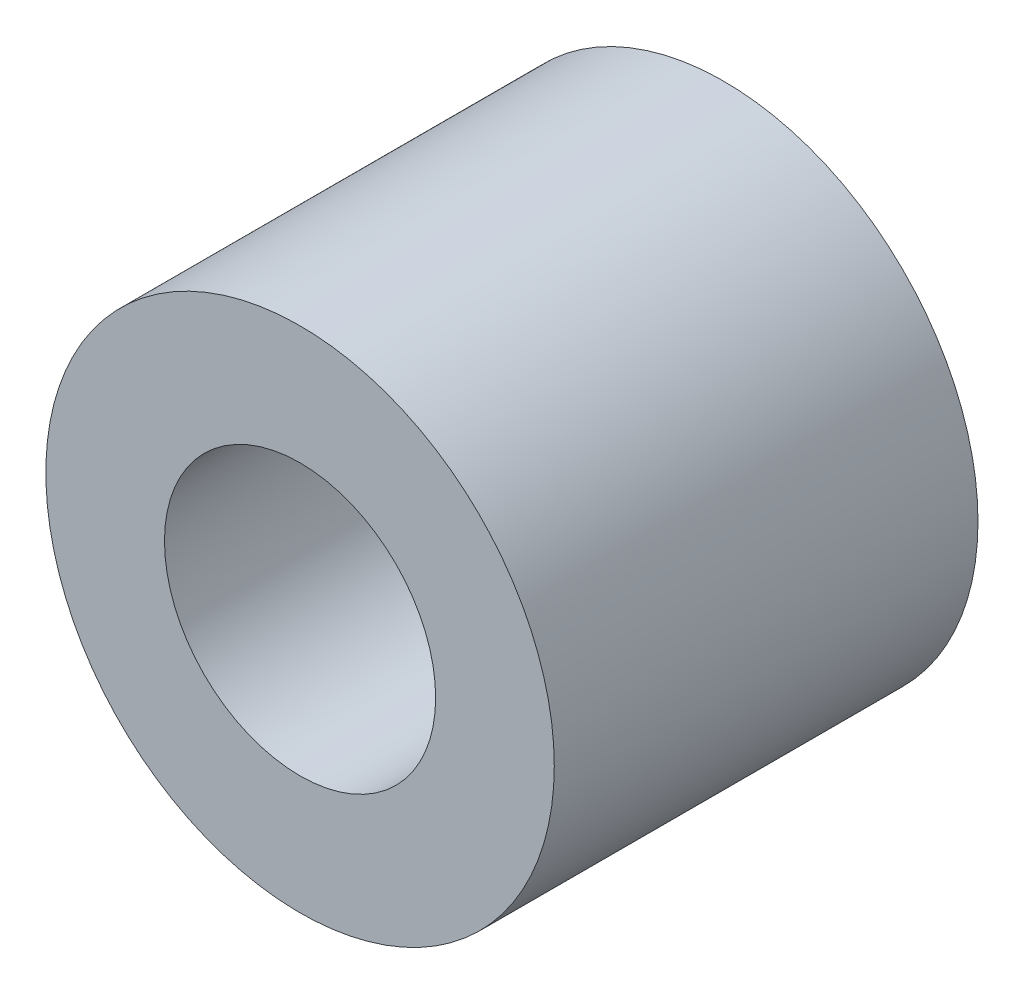
ISO-10303-21;
HEADER;
FILE_DESCRIPTION(('STEP AP214'),'2;1');
FILE_NAME('part.step','',(''),(''),'','','');
FILE_SCHEMA(('AUTOMOTIVE_DESIGN { 1 0 10303 214 1 1 1 1 }'));
ENDSEC;
DATA;
#1=APPLICATION_CONTEXT('core data for automotive mechanical design processes');
#2=APPLICATION_PROTOCOL_DEFINITION('international standard','automotive_design',2000,#1);
#3=PRODUCT_CONTEXT('',#1,'mechanical');
#4=PRODUCT('Part','Part','',(#3));
#5=PRODUCT_RELATED_PRODUCT_CATEGORY('part','',(#4));
#6=PRODUCT_DEFINITION_FORMATION('','',#4);
#7=PRODUCT_DEFINITION_CONTEXT('part definition',#1,'design');
#8=PRODUCT_DEFINITION('design','',#6,#7);
#9=PRODUCT_DEFINITION_SHAPE('','',#8);
#10=(LENGTH_UNIT() NAMED_UNIT(*) SI_UNIT(.MILLI.,.METRE.));
#11=(NAMED_UNIT(*) PLANE_ANGLE_UNIT() SI_UNIT($,.RADIAN.));
#12=(NAMED_UNIT(*) SI_UNIT($,.STERADIAN.) SOLID_ANGLE_UNIT());
#13=UNCERTAINTY_MEASURE_WITH_UNIT(LENGTH_MEASURE(1.E-05),#10,'distance_accuracy_value','');
#14=(GEOMETRIC_REPRESENTATION_CONTEXT(3) GLOBAL_UNCERTAINTY_ASSIGNED_CONTEXT((#13)) GLOBAL_UNIT_ASSIGNED_CONTEXT((#10,
#11,#12)) REPRESENTATION_CONTEXT('',''));
#15=CARTESIAN_POINT('',(0.,0.,0.));
#16=DIRECTION('',(0.,0.,1.));
#17=DIRECTION('',(1.,0.,0.));
#18=AXIS2_PLACEMENT_3D('',#15,#16,#17);
#19=CARTESIAN_POINT('',(0.,0.,5.));
#20=DIRECTION('',(0.,0.,1.));
#21=DIRECTION('',(1.,0.,0.));
#22=AXIS2_PLACEMENT_3D('',#19,#20,#21);
#23=PLANE('',#22);
#24=CARTESIAN_POINT('',(0.,0.,5.));
#25=DIRECTION('',(0.,0.,1.));
#26=DIRECTION('',(1.,0.,0.));
#27=AXIS2_PLACEMENT_3D('',#24,#25,#26);
#28=CIRCLE('',#27,3.);
#29=CARTESIAN_POINT('',(3.,0.,5.));
#30=VERTEX_POINT('',#29);
#31=EDGE_CURVE('E10',#30,#30,#28,.T.);
#32=ORIENTED_EDGE('',*,*,#31,.T.);
#33=EDGE_LOOP('',(#32));
#34=FACE_BOUND('',#33,.T.);
#35=CARTESIAN_POINT('',(0.,0.,5.));
#36=DIRECTION('',(0.,0.,1.));
#37=DIRECTION('',(1.,0.,0.));
#38=AXIS2_PLACEMENT_3D('',#35,#36,#37);
#39=CIRCLE('',#38,1.6);
#40=CARTESIAN_POINT('',(1.6,0.,5.));
#41=VERTEX_POINT('',#40);
#42=EDGE_CURVE('E44',#41,#41,#39,.T.);
#43=ORIENTED_EDGE('',*,*,#42,.F.);
#44=EDGE_LOOP('',(#43));
#45=FACE_BOUND('',#44,.T.);
#46=ADVANCED_FACE('F33',(#34,#45),#23,.T.);
#47=CARTESIAN_POINT('',(0.,0.,0.));
#48=DIRECTION('',(0.,0.,1.));
#49=DIRECTION('',(1.,0.,0.));
#50=AXIS2_PLACEMENT_3D('',#47,#48,#49);
#51=PLANE('',#50);
#52=CARTESIAN_POINT('',(0.,0.,0.));
#53=DIRECTION('',(0.,0.,1.));
#54=DIRECTION('',(1.,0.,0.));
#55=AXIS2_PLACEMENT_3D('',#52,#53,#54);
#56=CIRCLE('',#55,3.);
#57=CARTESIAN_POINT('',(3.,0.,0.));
#58=VERTEX_POINT('',#57);
#59=EDGE_CURVE('E37',#58,#58,#56,.T.);
#60=ORIENTED_EDGE('',*,*,#59,.F.);
#61=EDGE_LOOP('',(#60));
#62=FACE_BOUND('',#61,.T.);
#63=CARTESIAN_POINT('',(0.,0.,0.));
#64=DIRECTION('',(0.,0.,1.));
#65=DIRECTION('',(1.,0.,0.));
#66=AXIS2_PLACEMENT_3D('',#63,#64,#65);
#67=CIRCLE('',#66,1.6);
#68=CARTESIAN_POINT('',(1.6,0.,0.));
#69=VERTEX_POINT('',#68);
#70=EDGE_CURVE('E46',#69,#69,#67,.T.);
#71=ORIENTED_EDGE('',*,*,#70,.T.);
#72=EDGE_LOOP('',(#71));
#73=FACE_BOUND('',#72,.T.);
#74=ADVANCED_FACE('F56',(#62,#73),#51,.F.);
#75=CARTESIAN_POINT('',(0.,0.,5.));
#76=DIRECTION('',(0.,0.,-1.));
#77=DIRECTION('',(-1.,0.,0.));
#78=AXIS2_PLACEMENT_3D('',#75,#76,#77);
#79=CYLINDRICAL_SURFACE('',#78,3.);
#80=ORIENTED_EDGE('',*,*,#31,.F.);
#81=EDGE_LOOP('',(#80));
#82=FACE_BOUND('',#81,.T.);
#83=ORIENTED_EDGE('',*,*,#59,.T.);
#84=EDGE_LOOP('',(#83));
#85=FACE_BOUND('',#84,.T.);
#86=ADVANCED_FACE('F35',(#82,#85),#79,.T.);
#87=CARTESIAN_POINT('',(0.,0.,5.));
#88=DIRECTION('',(0.,0.,-1.));
#89=DIRECTION('',(-1.,0.,0.));
#90=AXIS2_PLACEMENT_3D('',#87,#88,#89);
#91=CYLINDRICAL_SURFACE('',#90,1.6);
#92=ORIENTED_EDGE('',*,*,#42,.T.);
#93=EDGE_LOOP('',(#92));
#94=FACE_BOUND('',#93,.T.);
#95=ORIENTED_EDGE('',*,*,#70,.F.);
#96=EDGE_LOOP('',(#95));
#97=FACE_BOUND('',#96,.T.);
#98=ADVANCED_FACE('F52',(#94,#97),#91,.F.);
#99=CLOSED_SHELL('',(#46,#74,#86,#98));
#100=MANIFOLD_SOLID_BREP('B2',#99);
#101=ADVANCED_BREP_SHAPE_REPRESENTATION('',(#18,#100),#14);
#102=SHAPE_DEFINITION_REPRESENTATION(#9,#101);
ENDSEC;
END-ISO-10303-21;
